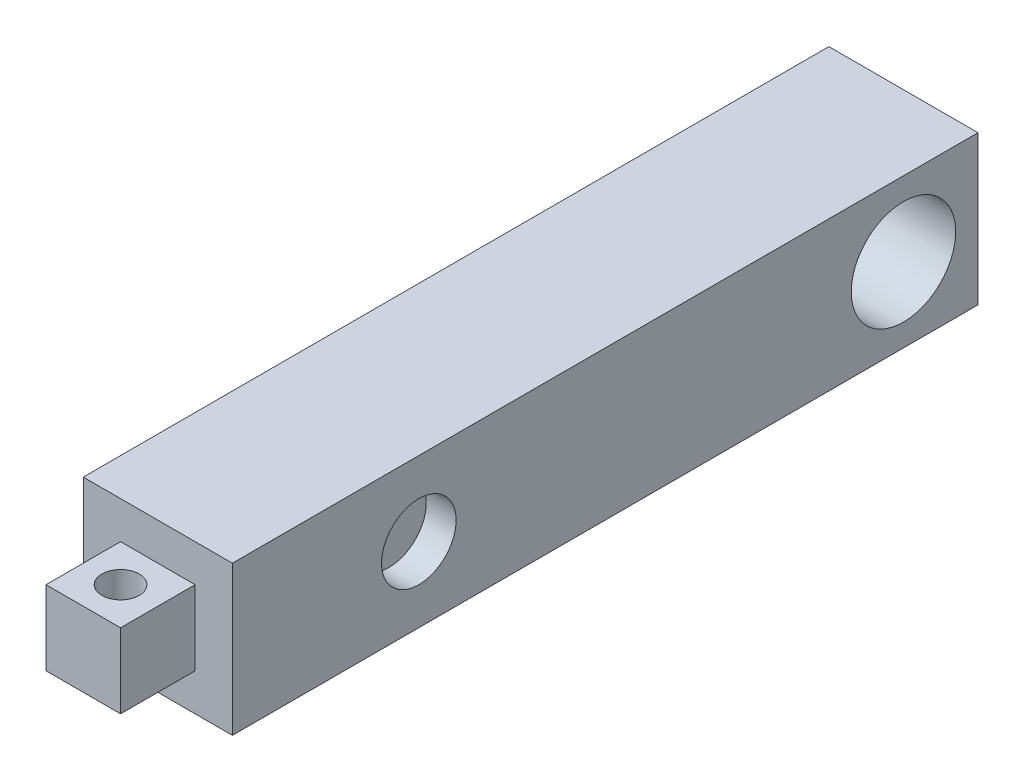
ISO-10303-21;
HEADER;
FILE_DESCRIPTION(('STEP AP214'),'2;1');
FILE_NAME('part.step','',(''),(''),'','','');
FILE_SCHEMA(('AUTOMOTIVE_DESIGN { 1 0 10303 214 1 1 1 1 }'));
ENDSEC;
DATA;
#1=APPLICATION_CONTEXT('core data for automotive mechanical design processes');
#2=APPLICATION_PROTOCOL_DEFINITION('international standard','automotive_design',2000,#1);
#3=PRODUCT_CONTEXT('',#1,'mechanical');
#4=PRODUCT('Part','Part','',(#3));
#5=PRODUCT_RELATED_PRODUCT_CATEGORY('part','',(#4));
#6=PRODUCT_DEFINITION_FORMATION('','',#4);
#7=PRODUCT_DEFINITION_CONTEXT('part definition',#1,'design');
#8=PRODUCT_DEFINITION('design','',#6,#7);
#9=PRODUCT_DEFINITION_SHAPE('','',#8);
#10=(LENGTH_UNIT() NAMED_UNIT(*) SI_UNIT(.MILLI.,.METRE.));
#11=(NAMED_UNIT(*) PLANE_ANGLE_UNIT() SI_UNIT($,.RADIAN.));
#12=(NAMED_UNIT(*) SI_UNIT($,.STERADIAN.) SOLID_ANGLE_UNIT());
#13=UNCERTAINTY_MEASURE_WITH_UNIT(LENGTH_MEASURE(1.E-05),#10,'distance_accuracy_value','');
#14=(GEOMETRIC_REPRESENTATION_CONTEXT(3) GLOBAL_UNCERTAINTY_ASSIGNED_CONTEXT((#13)) GLOBAL_UNIT_ASSIGNED_CONTEXT((#10,
#11,#12)) REPRESENTATION_CONTEXT('',''));
#15=CARTESIAN_POINT('',(0.,0.,0.));
#16=DIRECTION('',(0.,0.,1.));
#17=DIRECTION('',(1.,0.,0.));
#18=AXIS2_PLACEMENT_3D('',#15,#16,#17);
#19=CARTESIAN_POINT('',(0.,0.,1000.));
#20=DIRECTION('',(0.,0.,-1.));
#21=DIRECTION('',(-1.,0.,0.));
#22=AXIS2_PLACEMENT_3D('',#19,#20,#21);
#23=PLANE('',#22);
#24=DIRECTION('',(0.,1.,0.));
#25=VECTOR('',#24,1.);
#26=CARTESIAN_POINT('',(100.,-100.,1000.));
#27=LINE('',#26,#25);
#28=CARTESIAN_POINT('',(100.,-100.,1000.));
#29=VERTEX_POINT('',#28);
#30=CARTESIAN_POINT('',(100.,100.,1000.));
#31=VERTEX_POINT('',#30);
#32=EDGE_CURVE('E130',#29,#31,#27,.T.);
#33=ORIENTED_EDGE('',*,*,#32,.T.);
#34=DIRECTION('',(-1.,0.,0.));
#35=VECTOR('',#34,1.);
#36=CARTESIAN_POINT('',(-100.,100.,1000.));
#37=LINE('',#36,#35);
#38=CARTESIAN_POINT('',(-100.,100.,1000.));
#39=VERTEX_POINT('',#38);
#40=EDGE_CURVE('E133',#31,#39,#37,.T.);
#41=ORIENTED_EDGE('',*,*,#40,.T.);
#42=DIRECTION('',(0.,-1.,0.));
#43=VECTOR('',#42,1.);
#44=CARTESIAN_POINT('',(-100.,-100.,1000.));
#45=LINE('',#44,#43);
#46=CARTESIAN_POINT('',(-100.,-100.,1000.));
#47=VERTEX_POINT('',#46);
#48=EDGE_CURVE('E136',#39,#47,#45,.T.);
#49=ORIENTED_EDGE('',*,*,#48,.T.);
#50=DIRECTION('',(1.,0.,0.));
#51=VECTOR('',#50,1.);
#52=CARTESIAN_POINT('',(-100.,-100.,1000.));
#53=LINE('',#52,#51);
#54=EDGE_CURVE('E138',#47,#29,#53,.T.);
#55=ORIENTED_EDGE('',*,*,#54,.T.);
#56=EDGE_LOOP('',(#33,#41,#49,#55));
#57=FACE_BOUND('',#56,.T.);
#58=DIRECTION('',(0.,-1.,0.));
#59=VECTOR('',#58,1.);
#60=CARTESIAN_POINT('',(-50.,50.,1000.));
#61=LINE('',#60,#59);
#62=CARTESIAN_POINT('',(-50.,50.,1000.));
#63=VERTEX_POINT('',#62);
#64=CARTESIAN_POINT('',(-50.,-50.,1000.));
#65=VERTEX_POINT('',#64);
#66=EDGE_CURVE('E49',#63,#65,#61,.T.);
#67=ORIENTED_EDGE('',*,*,#66,.F.);
#68=DIRECTION('',(-1.,0.,0.));
#69=VECTOR('',#68,1.);
#70=CARTESIAN_POINT('',(50.,50.,1000.));
#71=LINE('',#70,#69);
#72=CARTESIAN_POINT('',(50.,50.,1000.));
#73=VERTEX_POINT('',#72);
#74=EDGE_CURVE('E53',#73,#63,#71,.T.);
#75=ORIENTED_EDGE('',*,*,#74,.F.);
#76=DIRECTION('',(0.,1.,0.));
#77=VECTOR('',#76,1.);
#78=CARTESIAN_POINT('',(50.,50.,1000.));
#79=LINE('',#78,#77);
#80=CARTESIAN_POINT('',(50.,-50.,1000.));
#81=VERTEX_POINT('',#80);
#82=EDGE_CURVE('E350',#81,#73,#79,.T.);
#83=ORIENTED_EDGE('',*,*,#82,.F.);
#84=DIRECTION('',(1.,0.,0.));
#85=VECTOR('',#84,1.);
#86=CARTESIAN_POINT('',(50.,-50.,1000.));
#87=LINE('',#86,#85);
#88=EDGE_CURVE('E348',#65,#81,#87,.T.);
#89=ORIENTED_EDGE('',*,*,#88,.F.);
#90=EDGE_LOOP('',(#67,#75,#83,#89));
#91=FACE_BOUND('',#90,.T.);
#92=ADVANCED_FACE('F32',(#57,#91),#23,.F.);
#93=CARTESIAN_POINT('',(100.,-100.,1000.));
#94=DIRECTION('',(-1.,0.,0.));
#95=DIRECTION('',(0.,0.,1.));
#96=AXIS2_PLACEMENT_3D('',#93,#94,#95);
#97=PLANE('',#96);
#98=CARTESIAN_POINT('',(100.,0.,750.));
#99=DIRECTION('',(1.,0.,0.));
#100=DIRECTION('',(0.,0.,-1.));
#101=AXIS2_PLACEMENT_3D('',#98,#99,#100);
#102=CIRCLE('',#101,50.);
#103=CARTESIAN_POINT('',(100.,0.,700.));
#104=VERTEX_POINT('',#103);
#105=EDGE_CURVE('E331',#104,#104,#102,.T.);
#106=ORIENTED_EDGE('',*,*,#105,.F.);
#107=EDGE_LOOP('',(#106));
#108=FACE_BOUND('',#107,.T.);
#109=CARTESIAN_POINT('',(100.,0.,100.));
#110=DIRECTION('',(-1.,0.,0.));
#111=DIRECTION('',(0.,0.,1.));
#112=AXIS2_PLACEMENT_3D('',#109,#110,#111);
#113=CIRCLE('',#112,70.);
#114=CARTESIAN_POINT('',(100.,0.,170.));
#115=VERTEX_POINT('',#114);
#116=EDGE_CURVE('E122',#115,#115,#113,.F.);
#117=ORIENTED_EDGE('',*,*,#116,.F.);
#118=EDGE_LOOP('',(#117));
#119=FACE_BOUND('',#118,.T.);
#120=DIRECTION('',(0.,1.,0.));
#121=VECTOR('',#120,1.);
#122=CARTESIAN_POINT('',(100.,-100.,0.));
#123=LINE('',#122,#121);
#124=CARTESIAN_POINT('',(100.,-100.,0.));
#125=VERTEX_POINT('',#124);
#126=CARTESIAN_POINT('',(100.,100.,0.));
#127=VERTEX_POINT('',#126);
#128=EDGE_CURVE('E129',#125,#127,#123,.T.);
#129=ORIENTED_EDGE('',*,*,#128,.T.);
#130=DIRECTION('',(0.,0.,-1.));
#131=VECTOR('',#130,1.);
#132=CARTESIAN_POINT('',(100.,100.,1000.));
#133=LINE('',#132,#131);
#134=EDGE_CURVE('E11',#31,#127,#133,.T.);
#135=ORIENTED_EDGE('',*,*,#134,.F.);
#136=ORIENTED_EDGE('',*,*,#32,.F.);
#137=DIRECTION('',(0.,0.,-1.));
#138=VECTOR('',#137,1.);
#139=CARTESIAN_POINT('',(100.,-100.,1000.));
#140=LINE('',#139,#138);
#141=EDGE_CURVE('E140',#29,#125,#140,.T.);
#142=ORIENTED_EDGE('',*,*,#141,.T.);
#143=EDGE_LOOP('',(#129,#135,#136,#142));
#144=FACE_BOUND('',#143,.T.);
#145=ADVANCED_FACE('F34',(#108,#119,#144),#97,.F.);
#146=CARTESIAN_POINT('',(-100.,100.,1000.));
#147=DIRECTION('',(0.,-1.,0.));
#148=DIRECTION('',(0.,0.,-1.));
#149=AXIS2_PLACEMENT_3D('',#146,#147,#148);
#150=PLANE('',#149);
#151=DIRECTION('',(-1.,0.,0.));
#152=VECTOR('',#151,1.);
#153=CARTESIAN_POINT('',(-100.,100.,0.));
#154=LINE('',#153,#152);
#155=CARTESIAN_POINT('',(-100.,100.,0.));
#156=VERTEX_POINT('',#155);
#157=EDGE_CURVE('E143',#127,#156,#154,.T.);
#158=ORIENTED_EDGE('',*,*,#157,.T.);
#159=DIRECTION('',(0.,0.,-1.));
#160=VECTOR('',#159,1.);
#161=CARTESIAN_POINT('',(-100.,100.,1000.));
#162=LINE('',#161,#160);
#163=EDGE_CURVE('E41',#39,#156,#162,.T.);
#164=ORIENTED_EDGE('',*,*,#163,.F.);
#165=ORIENTED_EDGE('',*,*,#40,.F.);
#166=ORIENTED_EDGE('',*,*,#134,.T.);
#167=EDGE_LOOP('',(#158,#164,#165,#166));
#168=FACE_BOUND('',#167,.T.);
#169=ADVANCED_FACE('F173',(#168),#150,.F.);
#170=CARTESIAN_POINT('',(-100.,-100.,1000.));
#171=DIRECTION('',(1.,0.,0.));
#172=DIRECTION('',(0.,0.,-1.));
#173=AXIS2_PLACEMENT_3D('',#170,#171,#172);
#174=PLANE('',#173);
#175=CARTESIAN_POINT('',(-100.,0.,750.));
#176=DIRECTION('',(-1.,0.,0.));
#177=DIRECTION('',(0.,0.,1.));
#178=AXIS2_PLACEMENT_3D('',#175,#176,#177);
#179=CIRCLE('',#178,50.);
#180=CARTESIAN_POINT('',(-100.,0.,800.));
#181=VERTEX_POINT('',#180);
#182=EDGE_CURVE('E330',#181,#181,#179,.T.);
#183=ORIENTED_EDGE('',*,*,#182,.F.);
#184=EDGE_LOOP('',(#183));
#185=FACE_BOUND('',#184,.T.);
#186=CARTESIAN_POINT('',(-100.,0.,100.));
#187=DIRECTION('',(1.,0.,0.));
#188=DIRECTION('',(0.,0.,-1.));
#189=AXIS2_PLACEMENT_3D('',#186,#187,#188);
#190=CIRCLE('',#189,70.);
#191=CARTESIAN_POINT('',(-100.,0.,30.));
#192=VERTEX_POINT('',#191);
#193=EDGE_CURVE('E119',#192,#192,#190,.F.);
#194=ORIENTED_EDGE('',*,*,#193,.F.);
#195=EDGE_LOOP('',(#194));
#196=FACE_BOUND('',#195,.T.);
#197=DIRECTION('',(0.,-1.,0.));
#198=VECTOR('',#197,1.);
#199=CARTESIAN_POINT('',(-100.,-100.,0.));
#200=LINE('',#199,#198);
#201=CARTESIAN_POINT('',(-100.,-100.,0.));
#202=VERTEX_POINT('',#201);
#203=EDGE_CURVE('E145',#156,#202,#200,.T.);
#204=ORIENTED_EDGE('',*,*,#203,.T.);
#205=DIRECTION('',(0.,0.,-1.));
#206=VECTOR('',#205,1.);
#207=CARTESIAN_POINT('',(-100.,-100.,1000.));
#208=LINE('',#207,#206);
#209=EDGE_CURVE('E150',#47,#202,#208,.T.);
#210=ORIENTED_EDGE('',*,*,#209,.F.);
#211=ORIENTED_EDGE('',*,*,#48,.F.);
#212=ORIENTED_EDGE('',*,*,#163,.T.);
#213=EDGE_LOOP('',(#204,#210,#211,#212));
#214=FACE_BOUND('',#213,.T.);
#215=ADVANCED_FACE('F158',(#185,#196,#214),#174,.F.);
#216=CARTESIAN_POINT('',(-100.,-100.,1000.));
#217=DIRECTION('',(0.,1.,0.));
#218=DIRECTION('',(0.,0.,1.));
#219=AXIS2_PLACEMENT_3D('',#216,#217,#218);
#220=PLANE('',#219);
#221=DIRECTION('',(1.,0.,0.));
#222=VECTOR('',#221,1.);
#223=CARTESIAN_POINT('',(-100.,-100.,0.));
#224=LINE('',#223,#222);
#225=EDGE_CURVE('E134',#202,#125,#224,.T.);
#226=ORIENTED_EDGE('',*,*,#225,.T.);
#227=ORIENTED_EDGE('',*,*,#141,.F.);
#228=ORIENTED_EDGE('',*,*,#54,.F.);
#229=ORIENTED_EDGE('',*,*,#209,.T.);
#230=EDGE_LOOP('',(#226,#227,#228,#229));
#231=FACE_BOUND('',#230,.T.);
#232=ADVANCED_FACE('F167',(#231),#220,.F.);
#233=CARTESIAN_POINT('',(0.,0.,0.));
#234=DIRECTION('',(0.,0.,-1.));
#235=DIRECTION('',(-1.,0.,0.));
#236=AXIS2_PLACEMENT_3D('',#233,#234,#235);
#237=PLANE('',#236);
#238=ORIENTED_EDGE('',*,*,#128,.F.);
#239=ORIENTED_EDGE('',*,*,#225,.F.);
#240=ORIENTED_EDGE('',*,*,#203,.F.);
#241=ORIENTED_EDGE('',*,*,#157,.F.);
#242=EDGE_LOOP('',(#238,#239,#240,#241));
#243=FACE_BOUND('',#242,.T.);
#244=ADVANCED_FACE('F164',(#243),#237,.T.);
#245=CARTESIAN_POINT('',(200.,0.,100.));
#246=DIRECTION('',(-1.,0.,0.));
#247=DIRECTION('',(0.,0.,1.));
#248=AXIS2_PLACEMENT_3D('',#245,#246,#247);
#249=CYLINDRICAL_SURFACE('',#248,70.);
#250=ORIENTED_EDGE('',*,*,#193,.T.);
#251=EDGE_LOOP('',(#250));
#252=FACE_BOUND('',#251,.T.);
#253=ORIENTED_EDGE('',*,*,#116,.T.);
#254=EDGE_LOOP('',(#253));
#255=FACE_BOUND('',#254,.T.);
#256=ADVANCED_FACE('F188',(#252,#255),#249,.F.);
#257=CARTESIAN_POINT('',(-50.,50.,1100.));
#258=DIRECTION('',(1.,0.,0.));
#259=DIRECTION('',(0.,1.,0.));
#260=AXIS2_PLACEMENT_3D('',#257,#258,#259);
#261=PLANE('',#260);
#262=ORIENTED_EDGE('',*,*,#66,.T.);
#263=DIRECTION('',(0.,0.,-1.));
#264=VECTOR('',#263,1.);
#265=CARTESIAN_POINT('',(-50.,-50.,1100.));
#266=LINE('',#265,#264);
#267=CARTESIAN_POINT('',(-50.,-50.,1100.));
#268=VERTEX_POINT('',#267);
#269=EDGE_CURVE('E102',#268,#65,#266,.T.);
#270=ORIENTED_EDGE('',*,*,#269,.F.);
#271=DIRECTION('',(0.,-1.,0.));
#272=VECTOR('',#271,1.);
#273=CARTESIAN_POINT('',(-50.,50.,1100.));
#274=LINE('',#273,#272);
#275=CARTESIAN_POINT('',(-50.,50.,1100.));
#276=VERTEX_POINT('',#275);
#277=EDGE_CURVE('E108',#276,#268,#274,.T.);
#278=ORIENTED_EDGE('',*,*,#277,.F.);
#279=DIRECTION('',(0.,0.,-1.));
#280=VECTOR('',#279,1.);
#281=CARTESIAN_POINT('',(-50.,50.,1100.));
#282=LINE('',#281,#280);
#283=EDGE_CURVE('E346',#276,#63,#282,.T.);
#284=ORIENTED_EDGE('',*,*,#283,.T.);
#285=EDGE_LOOP('',(#262,#270,#278,#284));
#286=FACE_BOUND('',#285,.T.);
#287=ADVANCED_FACE('F118',(#286),#261,.F.);
#288=CARTESIAN_POINT('',(50.,-50.,1100.));
#289=DIRECTION('',(0.,1.,0.));
#290=DIRECTION('',(-1.,0.,0.));
#291=AXIS2_PLACEMENT_3D('',#288,#289,#290);
#292=PLANE('',#291);
#293=CARTESIAN_POINT('',(0.,-50.,1050.));
#294=DIRECTION('',(0.,1.,0.));
#295=DIRECTION('',(-1.,0.,0.));
#296=AXIS2_PLACEMENT_3D('',#293,#294,#295);
#297=CIRCLE('',#296,25.);
#298=CARTESIAN_POINT('',(-25.,-50.,1050.));
#299=VERTEX_POINT('',#298);
#300=EDGE_CURVE('E341',#299,#299,#297,.F.);
#301=ORIENTED_EDGE('',*,*,#300,.F.);
#302=EDGE_LOOP('',(#301));
#303=FACE_BOUND('',#302,.T.);
#304=ORIENTED_EDGE('',*,*,#88,.T.);
#305=DIRECTION('',(0.,0.,-1.));
#306=VECTOR('',#305,1.);
#307=CARTESIAN_POINT('',(50.,-50.,1100.));
#308=LINE('',#307,#306);
#309=CARTESIAN_POINT('',(50.,-50.,1100.));
#310=VERTEX_POINT('',#309);
#311=EDGE_CURVE('E104',#310,#81,#308,.T.);
#312=ORIENTED_EDGE('',*,*,#311,.F.);
#313=DIRECTION('',(1.,0.,0.));
#314=VECTOR('',#313,1.);
#315=CARTESIAN_POINT('',(50.,-50.,1100.));
#316=LINE('',#315,#314);
#317=EDGE_CURVE('E97',#268,#310,#316,.T.);
#318=ORIENTED_EDGE('',*,*,#317,.F.);
#319=ORIENTED_EDGE('',*,*,#269,.T.);
#320=EDGE_LOOP('',(#304,#312,#318,#319));
#321=FACE_BOUND('',#320,.T.);
#322=ADVANCED_FACE('F100',(#303,#321),#292,.F.);
#323=CARTESIAN_POINT('',(50.,50.,1100.));
#324=DIRECTION('',(-1.,0.,0.));
#325=DIRECTION('',(0.,-1.,0.));
#326=AXIS2_PLACEMENT_3D('',#323,#324,#325);
#327=PLANE('',#326);
#328=ORIENTED_EDGE('',*,*,#82,.T.);
#329=DIRECTION('',(0.,0.,-1.));
#330=VECTOR('',#329,1.);
#331=CARTESIAN_POINT('',(50.,50.,1100.));
#332=LINE('',#331,#330);
#333=CARTESIAN_POINT('',(50.,50.,1100.));
#334=VERTEX_POINT('',#333);
#335=EDGE_CURVE('E123',#334,#73,#332,.T.);
#336=ORIENTED_EDGE('',*,*,#335,.F.);
#337=DIRECTION('',(0.,1.,0.));
#338=VECTOR('',#337,1.);
#339=CARTESIAN_POINT('',(50.,50.,1100.));
#340=LINE('',#339,#338);
#341=EDGE_CURVE('E107',#310,#334,#340,.T.);
#342=ORIENTED_EDGE('',*,*,#341,.F.);
#343=ORIENTED_EDGE('',*,*,#311,.T.);
#344=EDGE_LOOP('',(#328,#336,#342,#343));
#345=FACE_BOUND('',#344,.T.);
#346=ADVANCED_FACE('F219',(#345),#327,.F.);
#347=CARTESIAN_POINT('',(50.,50.,1100.));
#348=DIRECTION('',(0.,-1.,0.));
#349=DIRECTION('',(1.,0.,0.));
#350=AXIS2_PLACEMENT_3D('',#347,#348,#349);
#351=PLANE('',#350);
#352=CARTESIAN_POINT('',(0.,50.,1050.));
#353=DIRECTION('',(0.,-1.,0.));
#354=DIRECTION('',(1.,0.,0.));
#355=AXIS2_PLACEMENT_3D('',#352,#353,#354);
#356=CIRCLE('',#355,25.);
#357=CARTESIAN_POINT('',(25.,50.,1050.));
#358=VERTEX_POINT('',#357);
#359=EDGE_CURVE('E36',#358,#358,#356,.F.);
#360=ORIENTED_EDGE('',*,*,#359,.F.);
#361=EDGE_LOOP('',(#360));
#362=FACE_BOUND('',#361,.T.);
#363=ORIENTED_EDGE('',*,*,#74,.T.);
#364=ORIENTED_EDGE('',*,*,#283,.F.);
#365=DIRECTION('',(-1.,0.,0.));
#366=VECTOR('',#365,1.);
#367=CARTESIAN_POINT('',(50.,50.,1100.));
#368=LINE('',#367,#366);
#369=EDGE_CURVE('E113',#334,#276,#368,.T.);
#370=ORIENTED_EDGE('',*,*,#369,.F.);
#371=ORIENTED_EDGE('',*,*,#335,.T.);
#372=EDGE_LOOP('',(#363,#364,#370,#371));
#373=FACE_BOUND('',#372,.T.);
#374=ADVANCED_FACE('F228',(#362,#373),#351,.F.);
#375=CARTESIAN_POINT('',(0.,0.,1100.));
#376=DIRECTION('',(0.,0.,-1.));
#377=DIRECTION('',(-1.,0.,0.));
#378=AXIS2_PLACEMENT_3D('',#375,#376,#377);
#379=PLANE('',#378);
#380=ORIENTED_EDGE('',*,*,#277,.T.);
#381=ORIENTED_EDGE('',*,*,#317,.T.);
#382=ORIENTED_EDGE('',*,*,#341,.T.);
#383=ORIENTED_EDGE('',*,*,#369,.T.);
#384=EDGE_LOOP('',(#380,#381,#382,#383));
#385=FACE_BOUND('',#384,.T.);
#386=ADVANCED_FACE('F111',(#385),#379,.F.);
#387=CARTESIAN_POINT('',(0.,-70.,1050.));
#388=DIRECTION('',(0.,1.,0.));
#389=DIRECTION('',(-1.,0.,0.));
#390=AXIS2_PLACEMENT_3D('',#387,#388,#389);
#391=CYLINDRICAL_SURFACE('',#390,25.);
#392=ORIENTED_EDGE('',*,*,#359,.T.);
#393=EDGE_LOOP('',(#392));
#394=FACE_BOUND('',#393,.T.);
#395=ORIENTED_EDGE('',*,*,#300,.T.);
#396=EDGE_LOOP('',(#395));
#397=FACE_BOUND('',#396,.T.);
#398=ADVANCED_FACE('F242',(#394,#397),#391,.F.);
#399=CARTESIAN_POINT('',(-60.,0.,750.));
#400=DIRECTION('',(-1.,0.,0.));
#401=DIRECTION('',(0.,0.,1.));
#402=AXIS2_PLACEMENT_3D('',#399,#400,#401);
#403=CYLINDRICAL_SURFACE('',#402,50.);
#404=CARTESIAN_POINT('',(-60.,0.,750.));
#405=DIRECTION('',(-1.,0.,0.));
#406=DIRECTION('',(0.,0.,1.));
#407=AXIS2_PLACEMENT_3D('',#404,#405,#406);
#408=CIRCLE('',#407,50.);
#409=CARTESIAN_POINT('',(-60.,0.,800.));
#410=VERTEX_POINT('',#409);
#411=EDGE_CURVE('E334',#410,#410,#408,.T.);
#412=ORIENTED_EDGE('',*,*,#411,.F.);
#413=EDGE_LOOP('',(#412));
#414=FACE_BOUND('',#413,.T.);
#415=ORIENTED_EDGE('',*,*,#182,.T.);
#416=EDGE_LOOP('',(#415));
#417=FACE_BOUND('',#416,.T.);
#418=ADVANCED_FACE('F248',(#414,#417),#403,.F.);
#419=CARTESIAN_POINT('',(-60.,0.,750.));
#420=DIRECTION('',(-1.,0.,0.));
#421=DIRECTION('',(0.,0.,1.));
#422=AXIS2_PLACEMENT_3D('',#419,#420,#421);
#423=PLANE('',#422);
#424=ORIENTED_EDGE('',*,*,#411,.T.);
#425=EDGE_LOOP('',(#424));
#426=FACE_BOUND('',#425,.T.);
#427=ADVANCED_FACE('F256',(#426),#423,.T.);
#428=CARTESIAN_POINT('',(60.,0.,750.));
#429=DIRECTION('',(1.,0.,0.));
#430=DIRECTION('',(0.,0.,-1.));
#431=AXIS2_PLACEMENT_3D('',#428,#429,#430);
#432=CYLINDRICAL_SURFACE('',#431,50.);
#433=CARTESIAN_POINT('',(60.,0.,750.));
#434=DIRECTION('',(1.,0.,0.));
#435=DIRECTION('',(0.,0.,-1.));
#436=AXIS2_PLACEMENT_3D('',#433,#434,#435);
#437=CIRCLE('',#436,50.);
#438=CARTESIAN_POINT('',(60.,0.,700.));
#439=VERTEX_POINT('',#438);
#440=EDGE_CURVE('E329',#439,#439,#437,.T.);
#441=ORIENTED_EDGE('',*,*,#440,.F.);
#442=EDGE_LOOP('',(#441));
#443=FACE_BOUND('',#442,.T.);
#444=ORIENTED_EDGE('',*,*,#105,.T.);
#445=EDGE_LOOP('',(#444));
#446=FACE_BOUND('',#445,.T.);
#447=ADVANCED_FACE('F264',(#443,#446),#432,.F.);
#448=CARTESIAN_POINT('',(60.,0.,750.));
#449=DIRECTION('',(1.,0.,0.));
#450=DIRECTION('',(0.,0.,-1.));
#451=AXIS2_PLACEMENT_3D('',#448,#449,#450);
#452=PLANE('',#451);
#453=ORIENTED_EDGE('',*,*,#440,.T.);
#454=EDGE_LOOP('',(#453));
#455=FACE_BOUND('',#454,.T.);
#456=ADVANCED_FACE('F273',(#455),#452,.T.);
#457=CLOSED_SHELL('',(#92,#145,#169,#215,#232,#244,#256,#287,#322,#346,#374,#386,#398,#418,#427,
#447,#456));
#458=MANIFOLD_SOLID_BREP('B2',#457);
#459=ADVANCED_BREP_SHAPE_REPRESENTATION('',(#18,#458),#14);
#460=SHAPE_DEFINITION_REPRESENTATION(#9,#459);
ENDSEC;
END-ISO-10303-21;
